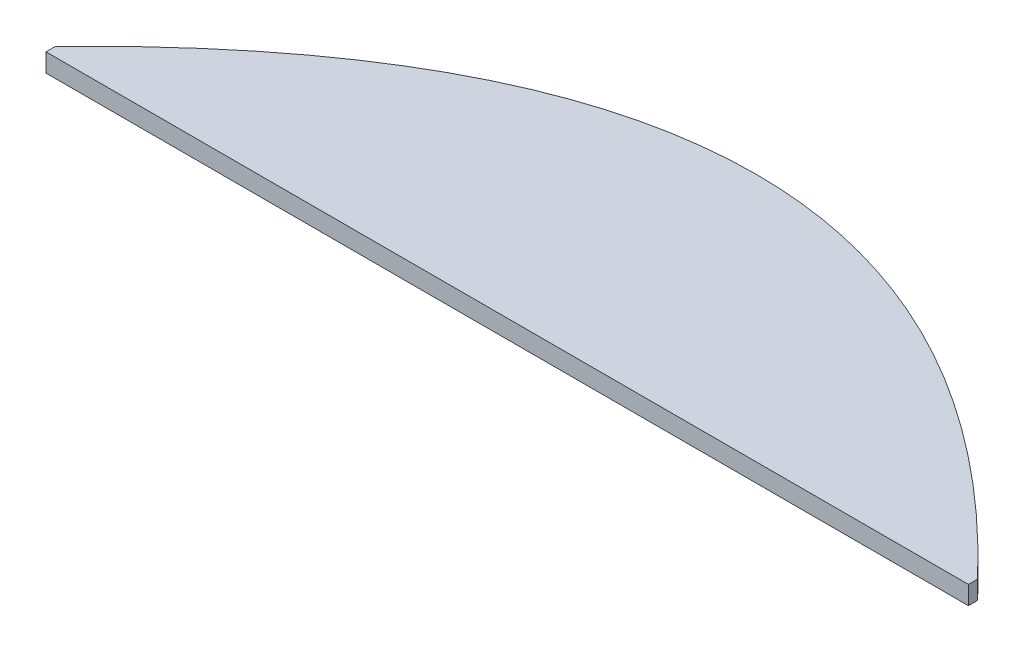
ISO-10303-21;
HEADER;
FILE_DESCRIPTION(('STEP AP214'),'2;1');
FILE_NAME('part.step','',(''),(''),'','','');
FILE_SCHEMA(('AUTOMOTIVE_DESIGN { 1 0 10303 214 1 1 1 1 }'));
ENDSEC;
DATA;
#1=APPLICATION_CONTEXT('core data for automotive mechanical design processes');
#2=APPLICATION_PROTOCOL_DEFINITION('international standard','automotive_design',2000,#1);
#3=PRODUCT_CONTEXT('',#1,'mechanical');
#4=PRODUCT('Part','Part','',(#3));
#5=PRODUCT_RELATED_PRODUCT_CATEGORY('part','',(#4));
#6=PRODUCT_DEFINITION_FORMATION('','',#4);
#7=PRODUCT_DEFINITION_CONTEXT('part definition',#1,'design');
#8=PRODUCT_DEFINITION('design','',#6,#7);
#9=PRODUCT_DEFINITION_SHAPE('','',#8);
#10=(LENGTH_UNIT() NAMED_UNIT(*) SI_UNIT(.MILLI.,.METRE.));
#11=(NAMED_UNIT(*) PLANE_ANGLE_UNIT() SI_UNIT($,.RADIAN.));
#12=(NAMED_UNIT(*) SI_UNIT($,.STERADIAN.) SOLID_ANGLE_UNIT());
#13=UNCERTAINTY_MEASURE_WITH_UNIT(LENGTH_MEASURE(1.E-05),#10,'distance_accuracy_value','');
#14=(GEOMETRIC_REPRESENTATION_CONTEXT(3) GLOBAL_UNCERTAINTY_ASSIGNED_CONTEXT((#13)) GLOBAL_UNIT_ASSIGNED_CONTEXT((#10,
#11,#12)) REPRESENTATION_CONTEXT('',''));
#15=CARTESIAN_POINT('',(0.,0.,0.));
#16=DIRECTION('',(0.,0.,1.));
#17=DIRECTION('',(1.,0.,0.));
#18=AXIS2_PLACEMENT_3D('',#15,#16,#17);
#19=CARTESIAN_POINT('',(250.,5.,0.));
#20=CARTESIAN_POINT('',(0.,5.,-260.));
#21=CARTESIAN_POINT('',(-250.,5.,0.));
#22=B_SPLINE_CURVE_WITH_KNOTS('',2,(#19,#20,#21),.UNSPECIFIED.,.F.,.F.,(3,3),(0.,1.),.UNSPECIFIED.);
#23=DIRECTION('',(0.,-1.,0.));
#24=VECTOR('',#23,1.);
#25=SURFACE_OF_LINEAR_EXTRUSION('',#22,#24);
#26=DIRECTION('',(0.,-1.,0.));
#27=VECTOR('',#26,1.);
#28=CARTESIAN_POINT('',(250.,5.,0.));
#29=LINE('',#28,#27);
#30=CARTESIAN_POINT('',(250.,5.,0.));
#31=VERTEX_POINT('',#30);
#32=CARTESIAN_POINT('',(250.,-5.,0.));
#33=VERTEX_POINT('',#32);
#34=EDGE_CURVE('E11',#31,#33,#29,.T.);
#35=ORIENTED_EDGE('',*,*,#34,.T.);
#36=CARTESIAN_POINT('',(-250.,-5.,0.));
#37=CARTESIAN_POINT('',(-7.17335045530287E-10,-5.,-259.999999999991));
#38=CARTESIAN_POINT('',(250.,-5.,0.));
#39=B_SPLINE_CURVE_WITH_KNOTS('',2,(#36,#37,#38),.UNSPECIFIED.,.F.,.F.,(3,3),(0.,1.),.UNSPECIFIED.);
#40=CARTESIAN_POINT('',(-250.,-5.,0.));
#41=VERTEX_POINT('',#40);
#42=EDGE_CURVE('E90',#41,#33,#39,.T.);
#43=ORIENTED_EDGE('',*,*,#42,.F.);
#44=DIRECTION('',(0.,-1.,0.));
#45=VECTOR('',#44,1.);
#46=CARTESIAN_POINT('',(-250.,5.,0.));
#47=LINE('',#46,#45);
#48=CARTESIAN_POINT('',(-250.,5.,0.));
#49=VERTEX_POINT('',#48);
#50=EDGE_CURVE('E43',#49,#41,#47,.T.);
#51=ORIENTED_EDGE('',*,*,#50,.F.);
#52=EDGE_CURVE('E106',#31,#49,#22,.T.);
#53=ORIENTED_EDGE('',*,*,#52,.F.);
#54=EDGE_LOOP('',(#35,#43,#51,#53));
#55=FACE_BOUND('',#54,.T.);
#56=ADVANCED_FACE('F35',(#55),#25,.F.);
#57=CARTESIAN_POINT('',(0.,5.,-130.));
#58=DIRECTION('',(0.,1.,0.));
#59=DIRECTION('',(0.,0.,1.));
#60=AXIS2_PLACEMENT_3D('',#57,#58,#59);
#61=PLANE('',#60);
#62=ORIENTED_EDGE('',*,*,#52,.T.);
#63=DIRECTION('',(0.,0.,-1.));
#64=VECTOR('',#63,1.);
#65=CARTESIAN_POINT('',(-250.,5.,5.));
#66=LINE('',#65,#64);
#67=CARTESIAN_POINT('',(-250.,5.,5.));
#68=VERTEX_POINT('',#67);
#69=EDGE_CURVE('E72',#68,#49,#66,.T.);
#70=ORIENTED_EDGE('',*,*,#69,.F.);
#71=DIRECTION('',(-1.,0.,0.));
#72=VECTOR('',#71,1.);
#73=CARTESIAN_POINT('',(-250.,5.,5.));
#74=LINE('',#73,#72);
#75=CARTESIAN_POINT('',(250.,5.,5.));
#76=VERTEX_POINT('',#75);
#77=EDGE_CURVE('E58',#76,#68,#74,.T.);
#78=ORIENTED_EDGE('',*,*,#77,.F.);
#79=DIRECTION('',(0.,0.,-1.));
#80=VECTOR('',#79,1.);
#81=CARTESIAN_POINT('',(250.,5.,5.));
#82=LINE('',#81,#80);
#83=EDGE_CURVE('E93',#76,#31,#82,.T.);
#84=ORIENTED_EDGE('',*,*,#83,.T.);
#85=EDGE_LOOP('',(#62,#70,#78,#84));
#86=FACE_BOUND('',#85,.T.);
#87=ADVANCED_FACE('F118',(#86),#61,.T.);
#88=CARTESIAN_POINT('',(-3.58664486999061E-10,-5.,-129.999999999995));
#89=DIRECTION('',(0.,1.,0.));
#90=DIRECTION('',(0.,0.,1.));
#91=AXIS2_PLACEMENT_3D('',#88,#89,#90);
#92=PLANE('',#91);
#93=ORIENTED_EDGE('',*,*,#42,.T.);
#94=DIRECTION('',(0.,0.,-1.));
#95=VECTOR('',#94,1.);
#96=CARTESIAN_POINT('',(250.,-5.,5.));
#97=LINE('',#96,#95);
#98=CARTESIAN_POINT('',(250.,-5.,5.));
#99=VERTEX_POINT('',#98);
#100=EDGE_CURVE('E87',#99,#33,#97,.T.);
#101=ORIENTED_EDGE('',*,*,#100,.F.);
#102=DIRECTION('',(1.,0.,0.));
#103=VECTOR('',#102,1.);
#104=CARTESIAN_POINT('',(-250.,-5.,5.));
#105=LINE('',#104,#103);
#106=CARTESIAN_POINT('',(-250.,-5.,5.));
#107=VERTEX_POINT('',#106);
#108=EDGE_CURVE('E79',#107,#99,#105,.T.);
#109=ORIENTED_EDGE('',*,*,#108,.F.);
#110=DIRECTION('',(0.,0.,-1.));
#111=VECTOR('',#110,1.);
#112=CARTESIAN_POINT('',(-250.,-5.,5.));
#113=LINE('',#112,#111);
#114=EDGE_CURVE('E92',#107,#41,#113,.T.);
#115=ORIENTED_EDGE('',*,*,#114,.T.);
#116=EDGE_LOOP('',(#93,#101,#109,#115));
#117=FACE_BOUND('',#116,.T.);
#118=ADVANCED_FACE('F88',(#117),#92,.F.);
#119=CARTESIAN_POINT('',(-250.,5.,5.));
#120=DIRECTION('',(1.,0.,0.));
#121=DIRECTION('',(0.,0.,-1.));
#122=AXIS2_PLACEMENT_3D('',#119,#120,#121);
#123=PLANE('',#122);
#124=ORIENTED_EDGE('',*,*,#50,.T.);
#125=ORIENTED_EDGE('',*,*,#114,.F.);
#126=DIRECTION('',(0.,-1.,0.));
#127=VECTOR('',#126,1.);
#128=CARTESIAN_POINT('',(-250.,5.,5.));
#129=LINE('',#128,#127);
#130=EDGE_CURVE('E84',#68,#107,#129,.T.);
#131=ORIENTED_EDGE('',*,*,#130,.F.);
#132=ORIENTED_EDGE('',*,*,#69,.T.);
#133=EDGE_LOOP('',(#124,#125,#131,#132));
#134=FACE_BOUND('',#133,.T.);
#135=ADVANCED_FACE('F127',(#134),#123,.F.);
#136=CARTESIAN_POINT('',(250.,5.,5.));
#137=DIRECTION('',(-1.,0.,0.));
#138=DIRECTION('',(0.,0.,1.));
#139=AXIS2_PLACEMENT_3D('',#136,#137,#138);
#140=PLANE('',#139);
#141=ORIENTED_EDGE('',*,*,#34,.F.);
#142=ORIENTED_EDGE('',*,*,#83,.F.);
#143=DIRECTION('',(0.,1.,0.));
#144=VECTOR('',#143,1.);
#145=CARTESIAN_POINT('',(250.,5.,5.));
#146=LINE('',#145,#144);
#147=EDGE_CURVE('E82',#99,#76,#146,.T.);
#148=ORIENTED_EDGE('',*,*,#147,.F.);
#149=ORIENTED_EDGE('',*,*,#100,.T.);
#150=EDGE_LOOP('',(#141,#142,#148,#149));
#151=FACE_BOUND('',#150,.T.);
#152=ADVANCED_FACE('F95',(#151),#140,.F.);
#153=CARTESIAN_POINT('',(0.,0.,5.));
#154=DIRECTION('',(0.,0.,1.));
#155=DIRECTION('',(1.,0.,0.));
#156=AXIS2_PLACEMENT_3D('',#153,#154,#155);
#157=PLANE('',#156);
#158=ORIENTED_EDGE('',*,*,#130,.T.);
#159=ORIENTED_EDGE('',*,*,#108,.T.);
#160=ORIENTED_EDGE('',*,*,#147,.T.);
#161=ORIENTED_EDGE('',*,*,#77,.T.);
#162=EDGE_LOOP('',(#158,#159,#160,#161));
#163=FACE_BOUND('',#162,.T.);
#164=ADVANCED_FACE('F80',(#163),#157,.T.);
#165=CLOSED_SHELL('',(#56,#87,#118,#135,#152,#164));
#166=MANIFOLD_SOLID_BREP('B2',#165);
#167=ADVANCED_BREP_SHAPE_REPRESENTATION('',(#18,#166),#14);
#168=SHAPE_DEFINITION_REPRESENTATION(#9,#167);
ENDSEC;
END-ISO-10303-21;
